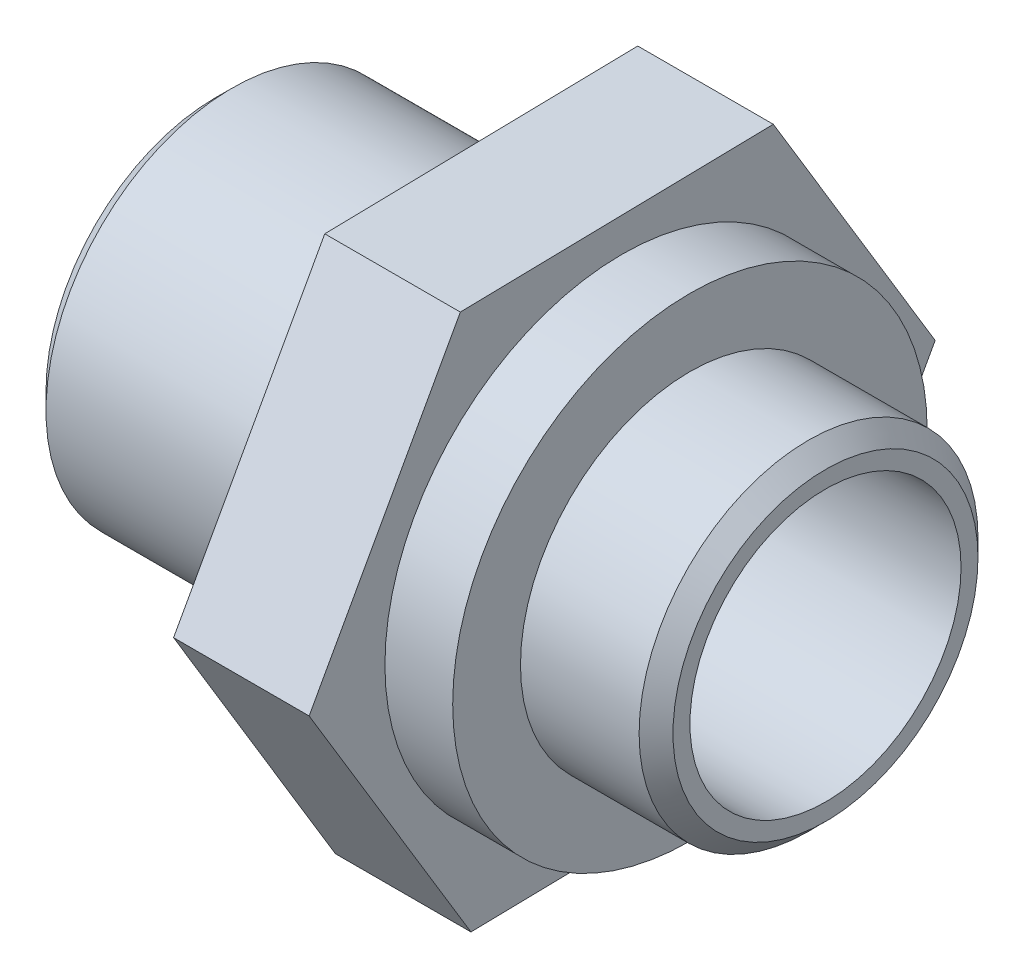
ISO-10303-21;
HEADER;
FILE_DESCRIPTION(('STEP AP214'),'2;1');
FILE_NAME('part.step','',(''),(''),'','','');
FILE_SCHEMA(('AUTOMOTIVE_DESIGN { 1 0 10303 214 1 1 1 1 }'));
ENDSEC;
DATA;
#1=APPLICATION_CONTEXT('core data for automotive mechanical design processes');
#2=APPLICATION_PROTOCOL_DEFINITION('international standard','automotive_design',2000,#1);
#3=PRODUCT_CONTEXT('',#1,'mechanical');
#4=PRODUCT('Part','Part','',(#3));
#5=PRODUCT_RELATED_PRODUCT_CATEGORY('part','',(#4));
#6=PRODUCT_DEFINITION_FORMATION('','',#4);
#7=PRODUCT_DEFINITION_CONTEXT('part definition',#1,'design');
#8=PRODUCT_DEFINITION('design','',#6,#7);
#9=PRODUCT_DEFINITION_SHAPE('','',#8);
#10=(LENGTH_UNIT() NAMED_UNIT(*) SI_UNIT(.MILLI.,.METRE.));
#11=(NAMED_UNIT(*) PLANE_ANGLE_UNIT() SI_UNIT($,.RADIAN.));
#12=(NAMED_UNIT(*) SI_UNIT($,.STERADIAN.) SOLID_ANGLE_UNIT());
#13=UNCERTAINTY_MEASURE_WITH_UNIT(LENGTH_MEASURE(1.E-05),#10,'distance_accuracy_value','');
#14=(GEOMETRIC_REPRESENTATION_CONTEXT(3) GLOBAL_UNCERTAINTY_ASSIGNED_CONTEXT((#13)) GLOBAL_UNIT_ASSIGNED_CONTEXT((#10,
#11,#12)) REPRESENTATION_CONTEXT('',''));
#15=CARTESIAN_POINT('',(0.,0.,0.));
#16=DIRECTION('',(0.,0.,1.));
#17=DIRECTION('',(1.,0.,0.));
#18=AXIS2_PLACEMENT_3D('',#15,#16,#17);
#19=CARTESIAN_POINT('',(4.,0.,0.));
#20=DIRECTION('',(-1.,0.,0.));
#21=DIRECTION('',(0.,0.,1.));
#22=AXIS2_PLACEMENT_3D('',#19,#20,#21);
#23=CYLINDRICAL_SURFACE('',#22,2.75);
#24=CARTESIAN_POINT('',(0.250000000000003,0.,0.));
#25=DIRECTION('',(1.,0.,0.));
#26=DIRECTION('',(0.,0.,-1.));
#27=AXIS2_PLACEMENT_3D('',#24,#25,#26);
#28=CIRCLE('',#27,2.75);
#29=CARTESIAN_POINT('',(0.250000000000003,0.,-2.75));
#30=VERTEX_POINT('',#29);
#31=EDGE_CURVE('E146',#30,#30,#28,.T.);
#32=ORIENTED_EDGE('',*,*,#31,.T.);
#33=EDGE_LOOP('',(#32));
#34=FACE_BOUND('',#33,.T.);
#35=CARTESIAN_POINT('',(4.,0.,0.));
#36=DIRECTION('',(1.,0.,0.));
#37=DIRECTION('',(0.,0.,-1.));
#38=AXIS2_PLACEMENT_3D('',#35,#36,#37);
#39=CIRCLE('',#38,2.75);
#40=CARTESIAN_POINT('',(4.,0.,-2.75));
#41=VERTEX_POINT('',#40);
#42=EDGE_CURVE('E142',#41,#41,#39,.T.);
#43=ORIENTED_EDGE('',*,*,#42,.F.);
#44=EDGE_LOOP('',(#43));
#45=FACE_BOUND('',#44,.T.);
#46=ADVANCED_FACE('F35',(#34,#45),#23,.T.);
#47=CARTESIAN_POINT('',(0.,0.,0.));
#48=DIRECTION('',(1.,0.,0.));
#49=DIRECTION('',(0.,0.,-1.));
#50=AXIS2_PLACEMENT_3D('',#47,#48,#49);
#51=PLANE('',#50);
#52=CARTESIAN_POINT('',(0.,0.,0.));
#53=DIRECTION('',(1.,0.,0.));
#54=DIRECTION('',(0.,0.,-1.));
#55=AXIS2_PLACEMENT_3D('',#52,#53,#54);
#56=CIRCLE('',#55,2.49999999999999);
#57=CARTESIAN_POINT('',(0.,0.,-2.49999999999999));
#58=VERTEX_POINT('',#57);
#59=EDGE_CURVE('E149',#58,#58,#56,.F.);
#60=ORIENTED_EDGE('',*,*,#59,.T.);
#61=EDGE_LOOP('',(#60));
#62=FACE_BOUND('',#61,.T.);
#63=CARTESIAN_POINT('',(0.,0.,0.));
#64=DIRECTION('',(1.,0.,0.));
#65=DIRECTION('',(0.,0.,-1.));
#66=AXIS2_PLACEMENT_3D('',#63,#64,#65);
#67=CIRCLE('',#66,2.);
#68=CARTESIAN_POINT('',(0.,0.,-2.));
#69=VERTEX_POINT('',#68);
#70=EDGE_CURVE('E229',#69,#69,#67,.T.);
#71=ORIENTED_EDGE('',*,*,#70,.T.);
#72=EDGE_LOOP('',(#71));
#73=FACE_BOUND('',#72,.T.);
#74=ADVANCED_FACE('F168',(#62,#73),#51,.F.);
#75=CARTESIAN_POINT('',(6.,0.0904044242228242,-4.61791731989804));
#76=DIRECTION('',(0.,-0.516855043492761,0.856072931481948));
#77=DIRECTION('',(0.,-0.856072931481948,-0.516855043492761));
#78=AXIS2_PLACEMENT_3D('',#75,#76,#77);
#79=PLANE('',#78);
#80=DIRECTION('',(0.,0.856072931481948,0.516855043492761));
#81=VECTOR('',#80,1.);
#82=CARTESIAN_POINT('',(4.,0.0904044242228242,-4.61791731989804));
#83=LINE('',#82,#81);
#84=CARTESIAN_POINT('',(4.,0.0904044242228242,-4.61791731989804));
#85=VERTEX_POINT('',#84);
#86=CARTESIAN_POINT('',(4.,4.04443592371926,-2.23066613195755));
#87=VERTEX_POINT('',#86);
#88=EDGE_CURVE('E122',#85,#87,#83,.T.);
#89=ORIENTED_EDGE('',*,*,#88,.T.);
#90=DIRECTION('',(-1.,0.,0.));
#91=VECTOR('',#90,1.);
#92=CARTESIAN_POINT('',(6.,4.04443592371926,-2.23066613195755));
#93=LINE('',#92,#91);
#94=CARTESIAN_POINT('',(6.,4.04443592371926,-2.23066613195755));
#95=VERTEX_POINT('',#94);
#96=EDGE_CURVE('E140',#95,#87,#93,.T.);
#97=ORIENTED_EDGE('',*,*,#96,.F.);
#98=DIRECTION('',(0.,0.856072931481948,0.516855043492761));
#99=VECTOR('',#98,1.);
#100=CARTESIAN_POINT('',(6.,0.0904044242228242,-4.61791731989804));
#101=LINE('',#100,#99);
#102=CARTESIAN_POINT('',(6.,0.0904044242228242,-4.61791731989804));
#103=VERTEX_POINT('',#102);
#104=EDGE_CURVE('E133',#103,#95,#101,.T.);
#105=ORIENTED_EDGE('',*,*,#104,.F.);
#106=DIRECTION('',(-1.,0.,0.));
#107=VECTOR('',#106,1.);
#108=CARTESIAN_POINT('',(6.,0.0904044242228242,-4.61791731989804));
#109=LINE('',#108,#107);
#110=EDGE_CURVE('E118',#103,#85,#109,.T.);
#111=ORIENTED_EDGE('',*,*,#110,.T.);
#112=EDGE_LOOP('',(#89,#97,#105,#111));
#113=FACE_BOUND('',#112,.T.);
#114=ADVANCED_FACE('F174',(#113),#79,.F.);
#115=CARTESIAN_POINT('',(6.,4.04443592371926,-2.23066613195755));
#116=DIRECTION('',(0.,-0.999808427901963,-0.0195731319978677));
#117=DIRECTION('',(0.,0.0195731319978677,-0.999808427901963));
#118=AXIS2_PLACEMENT_3D('',#115,#116,#117);
#119=PLANE('',#118);
#120=DIRECTION('',(0.,-0.0195731319978677,0.999808427901963));
#121=VECTOR('',#120,1.);
#122=CARTESIAN_POINT('',(4.,4.04443592371926,-2.23066613195755));
#123=LINE('',#122,#121);
#124=CARTESIAN_POINT('',(4.,3.95403149949644,2.38725118794049));
#125=VERTEX_POINT('',#124);
#126=EDGE_CURVE('E125',#87,#125,#123,.T.);
#127=ORIENTED_EDGE('',*,*,#126,.T.);
#128=DIRECTION('',(-1.,0.,0.));
#129=VECTOR('',#128,1.);
#130=CARTESIAN_POINT('',(6.,3.95403149949644,2.38725118794049));
#131=LINE('',#130,#129);
#132=CARTESIAN_POINT('',(6.,3.95403149949644,2.38725118794049));
#133=VERTEX_POINT('',#132);
#134=EDGE_CURVE('E137',#133,#125,#131,.T.);
#135=ORIENTED_EDGE('',*,*,#134,.F.);
#136=DIRECTION('',(0.,-0.0195731319978677,0.999808427901963));
#137=VECTOR('',#136,1.);
#138=CARTESIAN_POINT('',(6.,4.04443592371926,-2.23066613195755));
#139=LINE('',#138,#137);
#140=EDGE_CURVE('E91',#95,#133,#139,.T.);
#141=ORIENTED_EDGE('',*,*,#140,.F.);
#142=ORIENTED_EDGE('',*,*,#96,.T.);
#143=EDGE_LOOP('',(#127,#135,#141,#142));
#144=FACE_BOUND('',#143,.T.);
#145=ADVANCED_FACE('F186',(#144),#119,.F.);
#146=CARTESIAN_POINT('',(6.,3.95403149949644,2.38725118794049));
#147=DIRECTION('',(0.,-0.482953384409202,-0.875646063479816));
#148=DIRECTION('',(0.,0.875646063479816,-0.482953384409202));
#149=AXIS2_PLACEMENT_3D('',#146,#147,#148);
#150=PLANE('',#149);
#151=DIRECTION('',(0.,-0.875646063479816,0.482953384409202));
#152=VECTOR('',#151,1.);
#153=CARTESIAN_POINT('',(4.,3.95403149949644,2.38725118794049));
#154=LINE('',#153,#152);
#155=CARTESIAN_POINT('',(4.,-0.0904044242228225,4.61791731989804));
#156=VERTEX_POINT('',#155);
#157=EDGE_CURVE('E128',#125,#156,#154,.T.);
#158=ORIENTED_EDGE('',*,*,#157,.T.);
#159=DIRECTION('',(-1.,0.,0.));
#160=VECTOR('',#159,1.);
#161=CARTESIAN_POINT('',(6.,-0.0904044242228225,4.61791731989804));
#162=LINE('',#161,#160);
#163=CARTESIAN_POINT('',(6.,-0.0904044242228225,4.61791731989804));
#164=VERTEX_POINT('',#163);
#165=EDGE_CURVE('E113',#164,#156,#162,.T.);
#166=ORIENTED_EDGE('',*,*,#165,.F.);
#167=DIRECTION('',(0.,-0.875646063479816,0.482953384409202));
#168=VECTOR('',#167,1.);
#169=CARTESIAN_POINT('',(6.,3.95403149949644,2.38725118794049));
#170=LINE('',#169,#168);
#171=EDGE_CURVE('E104',#133,#164,#170,.T.);
#172=ORIENTED_EDGE('',*,*,#171,.F.);
#173=ORIENTED_EDGE('',*,*,#134,.T.);
#174=EDGE_LOOP('',(#158,#166,#172,#173));
#175=FACE_BOUND('',#174,.T.);
#176=ADVANCED_FACE('F190',(#175),#150,.F.);
#177=CARTESIAN_POINT('',(6.,-0.0904044242228225,4.61791731989804));
#178=DIRECTION('',(0.,0.516855043492761,-0.856072931481948));
#179=DIRECTION('',(0.,0.856072931481948,0.516855043492761));
#180=AXIS2_PLACEMENT_3D('',#177,#178,#179);
#181=PLANE('',#180);
#182=DIRECTION('',(0.,-0.856072931481948,-0.516855043492761));
#183=VECTOR('',#182,1.);
#184=CARTESIAN_POINT('',(4.,-0.0904044242228225,4.61791731989804));
#185=LINE('',#184,#183);
#186=CARTESIAN_POINT('',(4.,-4.04443592371926,2.23066613195755));
#187=VERTEX_POINT('',#186);
#188=EDGE_CURVE('E112',#156,#187,#185,.T.);
#189=ORIENTED_EDGE('',*,*,#188,.T.);
#190=DIRECTION('',(-1.,0.,0.));
#191=VECTOR('',#190,1.);
#192=CARTESIAN_POINT('',(6.,-4.04443592371926,2.23066613195755));
#193=LINE('',#192,#191);
#194=CARTESIAN_POINT('',(6.,-4.04443592371926,2.23066613195755));
#195=VERTEX_POINT('',#194);
#196=EDGE_CURVE('E109',#195,#187,#193,.T.);
#197=ORIENTED_EDGE('',*,*,#196,.F.);
#198=DIRECTION('',(0.,-0.856072931481948,-0.516855043492761));
#199=VECTOR('',#198,1.);
#200=CARTESIAN_POINT('',(6.,-0.0904044242228225,4.61791731989804));
#201=LINE('',#200,#199);
#202=EDGE_CURVE('E98',#164,#195,#201,.T.);
#203=ORIENTED_EDGE('',*,*,#202,.F.);
#204=ORIENTED_EDGE('',*,*,#165,.T.);
#205=EDGE_LOOP('',(#189,#197,#203,#204));
#206=FACE_BOUND('',#205,.T.);
#207=ADVANCED_FACE('F110',(#206),#181,.F.);
#208=CARTESIAN_POINT('',(6.,-4.04443592371926,2.23066613195755));
#209=DIRECTION('',(0.,0.999808427901963,0.0195731319978675));
#210=DIRECTION('',(0.,-0.0195731319978675,0.999808427901963));
#211=AXIS2_PLACEMENT_3D('',#208,#209,#210);
#212=PLANE('',#211);
#213=DIRECTION('',(0.,0.0195731319978675,-0.999808427901963));
#214=VECTOR('',#213,1.);
#215=CARTESIAN_POINT('',(4.,-4.04443592371926,2.23066613195755));
#216=LINE('',#215,#214);
#217=CARTESIAN_POINT('',(4.,-3.95403149949644,-2.38725118794049));
#218=VERTEX_POINT('',#217);
#219=EDGE_CURVE('E76',#187,#218,#216,.T.);
#220=ORIENTED_EDGE('',*,*,#219,.T.);
#221=DIRECTION('',(-1.,0.,0.));
#222=VECTOR('',#221,1.);
#223=CARTESIAN_POINT('',(6.,-3.95403149949644,-2.38725118794049));
#224=LINE('',#223,#222);
#225=CARTESIAN_POINT('',(6.,-3.95403149949644,-2.38725118794049));
#226=VERTEX_POINT('',#225);
#227=EDGE_CURVE('E114',#226,#218,#224,.T.);
#228=ORIENTED_EDGE('',*,*,#227,.F.);
#229=DIRECTION('',(0.,0.0195731319978675,-0.999808427901963));
#230=VECTOR('',#229,1.);
#231=CARTESIAN_POINT('',(6.,-4.04443592371926,2.23066613195755));
#232=LINE('',#231,#230);
#233=EDGE_CURVE('E102',#195,#226,#232,.T.);
#234=ORIENTED_EDGE('',*,*,#233,.F.);
#235=ORIENTED_EDGE('',*,*,#196,.T.);
#236=EDGE_LOOP('',(#220,#228,#234,#235));
#237=FACE_BOUND('',#236,.T.);
#238=ADVANCED_FACE('F116',(#237),#212,.F.);
#239=CARTESIAN_POINT('',(6.,-3.95403149949644,-2.38725118794049));
#240=DIRECTION('',(0.,0.482953384409202,0.875646063479816));
#241=DIRECTION('',(0.,-0.875646063479816,0.482953384409202));
#242=AXIS2_PLACEMENT_3D('',#239,#240,#241);
#243=PLANE('',#242);
#244=DIRECTION('',(0.,0.875646063479816,-0.482953384409202));
#245=VECTOR('',#244,1.);
#246=CARTESIAN_POINT('',(4.,-3.95403149949644,-2.38725118794049));
#247=LINE('',#246,#245);
#248=EDGE_CURVE('E82',#218,#85,#247,.T.);
#249=ORIENTED_EDGE('',*,*,#248,.T.);
#250=ORIENTED_EDGE('',*,*,#110,.F.);
#251=DIRECTION('',(0.,0.875646063479816,-0.482953384409202));
#252=VECTOR('',#251,1.);
#253=CARTESIAN_POINT('',(6.,-3.95403149949644,-2.38725118794049));
#254=LINE('',#253,#252);
#255=EDGE_CURVE('E53',#226,#103,#254,.T.);
#256=ORIENTED_EDGE('',*,*,#255,.F.);
#257=ORIENTED_EDGE('',*,*,#227,.T.);
#258=EDGE_LOOP('',(#249,#250,#256,#257));
#259=FACE_BOUND('',#258,.T.);
#260=ADVANCED_FACE('F198',(#259),#243,.F.);
#261=CARTESIAN_POINT('',(6.,0.,0.));
#262=DIRECTION('',(1.,0.,0.));
#263=DIRECTION('',(0.,0.,-1.));
#264=AXIS2_PLACEMENT_3D('',#261,#262,#263);
#265=PLANE('',#264);
#266=CARTESIAN_POINT('',(6.,0.,0.));
#267=DIRECTION('',(1.,0.,0.));
#268=DIRECTION('',(0.,0.,-1.));
#269=AXIS2_PLACEMENT_3D('',#266,#267,#268);
#270=CIRCLE('',#269,3.5);
#271=CARTESIAN_POINT('',(6.,0.,-3.5));
#272=VERTEX_POINT('',#271);
#273=EDGE_CURVE('E145',#272,#272,#270,.T.);
#274=ORIENTED_EDGE('',*,*,#273,.F.);
#275=EDGE_LOOP('',(#274));
#276=FACE_BOUND('',#275,.T.);
#277=ORIENTED_EDGE('',*,*,#104,.T.);
#278=ORIENTED_EDGE('',*,*,#140,.T.);
#279=ORIENTED_EDGE('',*,*,#171,.T.);
#280=ORIENTED_EDGE('',*,*,#202,.T.);
#281=ORIENTED_EDGE('',*,*,#233,.T.);
#282=ORIENTED_EDGE('',*,*,#255,.T.);
#283=EDGE_LOOP('',(#277,#278,#279,#280,#281,#282));
#284=FACE_BOUND('',#283,.T.);
#285=ADVANCED_FACE('F100',(#276,#284),#265,.T.);
#286=CARTESIAN_POINT('',(4.,0.,0.));
#287=DIRECTION('',(1.,0.,0.));
#288=DIRECTION('',(0.,0.,-1.));
#289=AXIS2_PLACEMENT_3D('',#286,#287,#288);
#290=PLANE('',#289);
#291=ORIENTED_EDGE('',*,*,#42,.T.);
#292=EDGE_LOOP('',(#291));
#293=FACE_BOUND('',#292,.T.);
#294=ORIENTED_EDGE('',*,*,#88,.F.);
#295=ORIENTED_EDGE('',*,*,#248,.F.);
#296=ORIENTED_EDGE('',*,*,#219,.F.);
#297=ORIENTED_EDGE('',*,*,#188,.F.);
#298=ORIENTED_EDGE('',*,*,#157,.F.);
#299=ORIENTED_EDGE('',*,*,#126,.F.);
#300=EDGE_LOOP('',(#294,#295,#296,#297,#298,#299));
#301=FACE_BOUND('',#300,.T.);
#302=ADVANCED_FACE('F201',(#293,#301),#290,.F.);
#303=CARTESIAN_POINT('',(7.,0.,0.));
#304=DIRECTION('',(-1.,0.,0.));
#305=DIRECTION('',(0.,0.,1.));
#306=AXIS2_PLACEMENT_3D('',#303,#304,#305);
#307=CYLINDRICAL_SURFACE('',#306,3.5);
#308=CARTESIAN_POINT('',(7.,0.,0.));
#309=DIRECTION('',(1.,0.,0.));
#310=DIRECTION('',(0.,0.,-1.));
#311=AXIS2_PLACEMENT_3D('',#308,#309,#310);
#312=CIRCLE('',#311,3.5);
#313=CARTESIAN_POINT('',(7.,0.,-3.5));
#314=VERTEX_POINT('',#313);
#315=EDGE_CURVE('E126',#314,#314,#312,.T.);
#316=ORIENTED_EDGE('',*,*,#315,.F.);
#317=EDGE_LOOP('',(#316));
#318=FACE_BOUND('',#317,.T.);
#319=ORIENTED_EDGE('',*,*,#273,.T.);
#320=EDGE_LOOP('',(#319));
#321=FACE_BOUND('',#320,.T.);
#322=ADVANCED_FACE('F204',(#318,#321),#307,.T.);
#323=CARTESIAN_POINT('',(7.,0.,0.));
#324=DIRECTION('',(1.,0.,0.));
#325=DIRECTION('',(0.,0.,-1.));
#326=AXIS2_PLACEMENT_3D('',#323,#324,#325);
#327=PLANE('',#326);
#328=CARTESIAN_POINT('',(7.,0.,0.));
#329=DIRECTION('',(1.,0.,0.));
#330=DIRECTION('',(0.,0.,-1.));
#331=AXIS2_PLACEMENT_3D('',#328,#329,#330);
#332=CIRCLE('',#331,2.5);
#333=CARTESIAN_POINT('',(7.,0.,-2.5));
#334=VERTEX_POINT('',#333);
#335=EDGE_CURVE('E150',#334,#334,#332,.T.);
#336=ORIENTED_EDGE('',*,*,#335,.F.);
#337=EDGE_LOOP('',(#336));
#338=FACE_BOUND('',#337,.T.);
#339=ORIENTED_EDGE('',*,*,#315,.T.);
#340=EDGE_LOOP('',(#339));
#341=FACE_BOUND('',#340,.T.);
#342=ADVANCED_FACE('F211',(#338,#341),#327,.T.);
#343=CARTESIAN_POINT('',(9.,0.,0.));
#344=DIRECTION('',(-1.,0.,0.));
#345=DIRECTION('',(0.,0.,1.));
#346=AXIS2_PLACEMENT_3D('',#343,#344,#345);
#347=CYLINDRICAL_SURFACE('',#346,2.5);
#348=CARTESIAN_POINT('',(8.75,0.,0.));
#349=DIRECTION('',(1.,0.,0.));
#350=DIRECTION('',(0.,0.,-1.));
#351=AXIS2_PLACEMENT_3D('',#348,#349,#350);
#352=CIRCLE('',#351,2.5);
#353=CARTESIAN_POINT('',(8.75,0.,-2.5));
#354=VERTEX_POINT('',#353);
#355=EDGE_CURVE('E11',#354,#354,#352,.F.);
#356=ORIENTED_EDGE('',*,*,#355,.T.);
#357=EDGE_LOOP('',(#356));
#358=FACE_BOUND('',#357,.T.);
#359=ORIENTED_EDGE('',*,*,#335,.T.);
#360=EDGE_LOOP('',(#359));
#361=FACE_BOUND('',#360,.T.);
#362=ADVANCED_FACE('F215',(#358,#361),#347,.T.);
#363=CARTESIAN_POINT('',(9.,0.,0.));
#364=DIRECTION('',(1.,0.,0.));
#365=DIRECTION('',(0.,0.,-1.));
#366=AXIS2_PLACEMENT_3D('',#363,#364,#365);
#367=PLANE('',#366);
#368=CARTESIAN_POINT('',(9.,0.,0.));
#369=DIRECTION('',(1.,0.,0.));
#370=DIRECTION('',(0.,0.,-1.));
#371=AXIS2_PLACEMENT_3D('',#368,#369,#370);
#372=CIRCLE('',#371,2.25);
#373=CARTESIAN_POINT('',(9.,0.,-2.25));
#374=VERTEX_POINT('',#373);
#375=EDGE_CURVE('E45',#374,#374,#372,.T.);
#376=ORIENTED_EDGE('',*,*,#375,.T.);
#377=EDGE_LOOP('',(#376));
#378=FACE_BOUND('',#377,.T.);
#379=CARTESIAN_POINT('',(9.,0.,0.));
#380=DIRECTION('',(1.,0.,0.));
#381=DIRECTION('',(0.,0.,-1.));
#382=AXIS2_PLACEMENT_3D('',#379,#380,#381);
#383=CIRCLE('',#382,2.);
#384=CARTESIAN_POINT('',(9.,0.,-2.));
#385=VERTEX_POINT('',#384);
#386=EDGE_CURVE('E232',#385,#385,#383,.T.);
#387=ORIENTED_EDGE('',*,*,#386,.F.);
#388=EDGE_LOOP('',(#387));
#389=FACE_BOUND('',#388,.T.);
#390=ADVANCED_FACE('F155',(#378,#389),#367,.T.);
#391=CARTESIAN_POINT('',(0.,0.,0.));
#392=DIRECTION('',(1.,0.,0.));
#393=DIRECTION('',(0.,0.,-1.));
#394=AXIS2_PLACEMENT_3D('',#391,#392,#393);
#395=CYLINDRICAL_SURFACE('',#394,2.);
#396=ORIENTED_EDGE('',*,*,#70,.F.);
#397=EDGE_LOOP('',(#396));
#398=FACE_BOUND('',#397,.T.);
#399=ORIENTED_EDGE('',*,*,#386,.T.);
#400=EDGE_LOOP('',(#399));
#401=FACE_BOUND('',#400,.T.);
#402=ADVANCED_FACE('F164',(#398,#401),#395,.F.);
#403=CARTESIAN_POINT('',(0.250000000000003,0.,0.));
#404=DIRECTION('',(1.,0.,0.));
#405=DIRECTION('',(0.,0.,-1.));
#406=AXIS2_PLACEMENT_3D('',#403,#404,#405);
#407=CONICAL_SURFACE('',#406,2.75,0.785398163397453);
#408=ORIENTED_EDGE('',*,*,#59,.F.);
#409=EDGE_LOOP('',(#408));
#410=FACE_BOUND('',#409,.T.);
#411=ORIENTED_EDGE('',*,*,#31,.F.);
#412=EDGE_LOOP('',(#411));
#413=FACE_BOUND('',#412,.T.);
#414=ADVANCED_FACE('F159',(#410,#413),#407,.T.);
#415=CARTESIAN_POINT('',(9.,0.,0.));
#416=DIRECTION('',(-1.,0.,0.));
#417=DIRECTION('',(0.,0.,1.));
#418=AXIS2_PLACEMENT_3D('',#415,#416,#417);
#419=CONICAL_SURFACE('',#418,2.25,0.785398163397444);
#420=ORIENTED_EDGE('',*,*,#355,.F.);
#421=EDGE_LOOP('',(#420));
#422=FACE_BOUND('',#421,.T.);
#423=ORIENTED_EDGE('',*,*,#375,.F.);
#424=EDGE_LOOP('',(#423));
#425=FACE_BOUND('',#424,.T.);
#426=ADVANCED_FACE('F38',(#422,#425),#419,.T.);
#427=CLOSED_SHELL('',(#46,#74,#114,#145,#176,#207,#238,#260,#285,#302,#322,#342,#362,#390,#402,
#414,#426));
#428=MANIFOLD_SOLID_BREP('B2',#427);
#429=ADVANCED_BREP_SHAPE_REPRESENTATION('',(#18,#428),#14);
#430=SHAPE_DEFINITION_REPRESENTATION(#9,#429);
ENDSEC;
END-ISO-10303-21;
